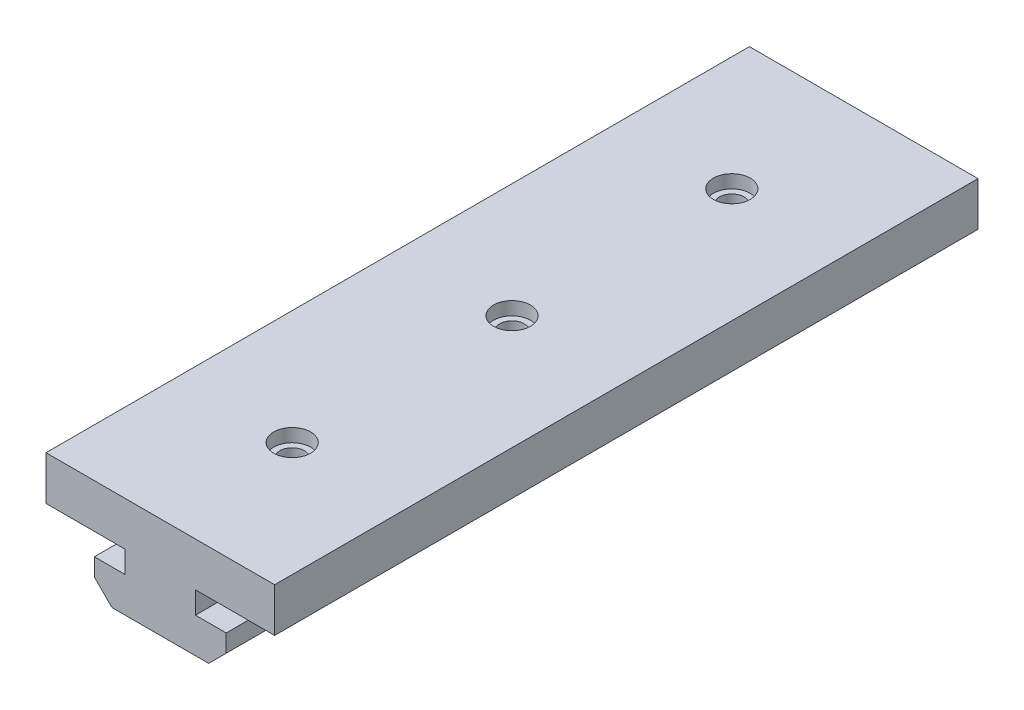
ISO-10303-21;
HEADER;
FILE_DESCRIPTION(('STEP AP214'),'2;1');
FILE_NAME('part.step','',(''),(''),'','','');
FILE_SCHEMA(('AUTOMOTIVE_DESIGN { 1 0 10303 214 1 1 1 1 }'));
ENDSEC;
DATA;
#1=APPLICATION_CONTEXT('core data for automotive mechanical design processes');
#2=APPLICATION_PROTOCOL_DEFINITION('international standard','automotive_design',2000,#1);
#3=PRODUCT_CONTEXT('',#1,'mechanical');
#4=PRODUCT('Part','Part','',(#3));
#5=PRODUCT_RELATED_PRODUCT_CATEGORY('part','',(#4));
#6=PRODUCT_DEFINITION_FORMATION('','',#4);
#7=PRODUCT_DEFINITION_CONTEXT('part definition',#1,'design');
#8=PRODUCT_DEFINITION('design','',#6,#7);
#9=PRODUCT_DEFINITION_SHAPE('','',#8);
#10=(LENGTH_UNIT() NAMED_UNIT(*) SI_UNIT(.MILLI.,.METRE.));
#11=(NAMED_UNIT(*) PLANE_ANGLE_UNIT() SI_UNIT($,.RADIAN.));
#12=(NAMED_UNIT(*) SI_UNIT($,.STERADIAN.) SOLID_ANGLE_UNIT());
#13=UNCERTAINTY_MEASURE_WITH_UNIT(LENGTH_MEASURE(1.E-05),#10,'distance_accuracy_value','');
#14=(GEOMETRIC_REPRESENTATION_CONTEXT(3) GLOBAL_UNCERTAINTY_ASSIGNED_CONTEXT((#13)) GLOBAL_UNIT_ASSIGNED_CONTEXT((#10,
#11,#12)) REPRESENTATION_CONTEXT('',''));
#15=CARTESIAN_POINT('',(0.,0.,0.));
#16=DIRECTION('',(0.,0.,1.));
#17=DIRECTION('',(1.,0.,0.));
#18=AXIS2_PLACEMENT_3D('',#15,#16,#17);
#19=CARTESIAN_POINT('',(-13.,5.,80.));
#20=DIRECTION('',(1.,0.,0.));
#21=DIRECTION('',(0.,0.,-1.));
#22=AXIS2_PLACEMENT_3D('',#19,#20,#21);
#23=PLANE('',#22);
#24=DIRECTION('',(0.,-1.,0.));
#25=VECTOR('',#24,1.);
#26=CARTESIAN_POINT('',(-13.,5.,0.));
#27=LINE('',#26,#25);
#28=CARTESIAN_POINT('',(-13.,5.,0.));
#29=VERTEX_POINT('',#28);
#30=CARTESIAN_POINT('',(-13.,0.,0.));
#31=VERTEX_POINT('',#30);
#32=EDGE_CURVE('E165',#29,#31,#27,.T.);
#33=ORIENTED_EDGE('',*,*,#32,.T.);
#34=DIRECTION('',(0.,0.,-1.));
#35=VECTOR('',#34,1.);
#36=CARTESIAN_POINT('',(-13.,0.,80.));
#37=LINE('',#36,#35);
#38=CARTESIAN_POINT('',(-13.,0.,80.));
#39=VERTEX_POINT('',#38);
#40=EDGE_CURVE('E11',#39,#31,#37,.T.);
#41=ORIENTED_EDGE('',*,*,#40,.F.);
#42=DIRECTION('',(0.,-1.,0.));
#43=VECTOR('',#42,1.);
#44=CARTESIAN_POINT('',(-13.,5.,80.));
#45=LINE('',#44,#43);
#46=CARTESIAN_POINT('',(-13.,5.,80.));
#47=VERTEX_POINT('',#46);
#48=EDGE_CURVE('E192',#47,#39,#45,.T.);
#49=ORIENTED_EDGE('',*,*,#48,.F.);
#50=DIRECTION('',(0.,0.,-1.));
#51=VECTOR('',#50,1.);
#52=CARTESIAN_POINT('',(-13.,5.,80.));
#53=LINE('',#52,#51);
#54=EDGE_CURVE('E161',#47,#29,#53,.T.);
#55=ORIENTED_EDGE('',*,*,#54,.T.);
#56=EDGE_LOOP('',(#33,#41,#49,#55));
#57=FACE_BOUND('',#56,.T.);
#58=ADVANCED_FACE('F33',(#57),#23,.F.);
#59=CARTESIAN_POINT('',(-13.,0.,80.));
#60=DIRECTION('',(0.,1.,0.));
#61=DIRECTION('',(0.,0.,1.));
#62=AXIS2_PLACEMENT_3D('',#59,#60,#61);
#63=PLANE('',#62);
#64=DIRECTION('',(1.,0.,0.));
#65=VECTOR('',#64,1.);
#66=CARTESIAN_POINT('',(-13.,0.,0.));
#67=LINE('',#66,#65);
#68=CARTESIAN_POINT('',(-4.,0.,0.));
#69=VERTEX_POINT('',#68);
#70=EDGE_CURVE('E168',#31,#69,#67,.T.);
#71=ORIENTED_EDGE('',*,*,#70,.T.);
#72=DIRECTION('',(0.,0.,-1.));
#73=VECTOR('',#72,1.);
#74=CARTESIAN_POINT('',(-4.,0.,80.));
#75=LINE('',#74,#73);
#76=CARTESIAN_POINT('',(-4.,0.,80.));
#77=VERTEX_POINT('',#76);
#78=EDGE_CURVE('E41',#77,#69,#75,.T.);
#79=ORIENTED_EDGE('',*,*,#78,.F.);
#80=DIRECTION('',(1.,0.,0.));
#81=VECTOR('',#80,1.);
#82=CARTESIAN_POINT('',(-13.,0.,80.));
#83=LINE('',#82,#81);
#84=EDGE_CURVE('E110',#39,#77,#83,.T.);
#85=ORIENTED_EDGE('',*,*,#84,.F.);
#86=ORIENTED_EDGE('',*,*,#40,.T.);
#87=EDGE_LOOP('',(#71,#79,#85,#86));
#88=FACE_BOUND('',#87,.T.);
#89=ADVANCED_FACE('F283',(#88),#63,.F.);
#90=CARTESIAN_POINT('',(-4.,0.,80.));
#91=DIRECTION('',(1.,0.,0.));
#92=DIRECTION('',(0.,0.,-1.));
#93=AXIS2_PLACEMENT_3D('',#90,#91,#92);
#94=PLANE('',#93);
#95=DIRECTION('',(0.,-1.,0.));
#96=VECTOR('',#95,1.);
#97=CARTESIAN_POINT('',(-4.,0.,0.));
#98=LINE('',#97,#96);
#99=CARTESIAN_POINT('',(-4.,-2.5,0.));
#100=VERTEX_POINT('',#99);
#101=EDGE_CURVE('E171',#69,#100,#98,.T.);
#102=ORIENTED_EDGE('',*,*,#101,.T.);
#103=DIRECTION('',(0.,0.,-1.));
#104=VECTOR('',#103,1.);
#105=CARTESIAN_POINT('',(-4.,-2.5,80.));
#106=LINE('',#105,#104);
#107=CARTESIAN_POINT('',(-4.,-2.5,80.));
#108=VERTEX_POINT('',#107);
#109=EDGE_CURVE('E217',#108,#100,#106,.T.);
#110=ORIENTED_EDGE('',*,*,#109,.F.);
#111=DIRECTION('',(0.,-1.,0.));
#112=VECTOR('',#111,1.);
#113=CARTESIAN_POINT('',(-4.,0.,80.));
#114=LINE('',#113,#112);
#115=EDGE_CURVE('E225',#77,#108,#114,.T.);
#116=ORIENTED_EDGE('',*,*,#115,.F.);
#117=ORIENTED_EDGE('',*,*,#78,.T.);
#118=EDGE_LOOP('',(#102,#110,#116,#117));
#119=FACE_BOUND('',#118,.T.);
#120=ADVANCED_FACE('F223',(#119),#94,.F.);
#121=CARTESIAN_POINT('',(-4.,-2.5,80.));
#122=DIRECTION('',(0.,-1.,0.));
#123=DIRECTION('',(0.,0.,-1.));
#124=AXIS2_PLACEMENT_3D('',#121,#122,#123);
#125=PLANE('',#124);
#126=DIRECTION('',(-1.,0.,0.));
#127=VECTOR('',#126,1.);
#128=CARTESIAN_POINT('',(-4.,-2.5,0.));
#129=LINE('',#128,#127);
#130=CARTESIAN_POINT('',(-7.5,-2.5,0.));
#131=VERTEX_POINT('',#130);
#132=EDGE_CURVE('E173',#100,#131,#129,.T.);
#133=ORIENTED_EDGE('',*,*,#132,.T.);
#134=DIRECTION('',(0.,0.,-1.));
#135=VECTOR('',#134,1.);
#136=CARTESIAN_POINT('',(-7.5,-2.5,80.));
#137=LINE('',#136,#135);
#138=CARTESIAN_POINT('',(-7.5,-2.5,80.));
#139=VERTEX_POINT('',#138);
#140=EDGE_CURVE('E214',#139,#131,#137,.T.);
#141=ORIENTED_EDGE('',*,*,#140,.F.);
#142=DIRECTION('',(-1.,0.,0.));
#143=VECTOR('',#142,1.);
#144=CARTESIAN_POINT('',(-4.,-2.5,80.));
#145=LINE('',#144,#143);
#146=EDGE_CURVE('E243',#108,#139,#145,.T.);
#147=ORIENTED_EDGE('',*,*,#146,.F.);
#148=ORIENTED_EDGE('',*,*,#109,.T.);
#149=EDGE_LOOP('',(#133,#141,#147,#148));
#150=FACE_BOUND('',#149,.T.);
#151=ADVANCED_FACE('F234',(#150),#125,.F.);
#152=CARTESIAN_POINT('',(-7.5,-2.5,80.));
#153=DIRECTION('',(1.,0.,0.));
#154=DIRECTION('',(0.,0.,-1.));
#155=AXIS2_PLACEMENT_3D('',#152,#153,#154);
#156=PLANE('',#155);
#157=DIRECTION('',(0.,-1.,0.));
#158=VECTOR('',#157,1.);
#159=CARTESIAN_POINT('',(-7.5,-2.5,0.));
#160=LINE('',#159,#158);
#161=CARTESIAN_POINT('',(-7.5,-4.5,0.));
#162=VERTEX_POINT('',#161);
#163=EDGE_CURVE('E175',#131,#162,#160,.T.);
#164=ORIENTED_EDGE('',*,*,#163,.T.);
#165=DIRECTION('',(0.,0.,-1.));
#166=VECTOR('',#165,1.);
#167=CARTESIAN_POINT('',(-7.5,-4.5,80.));
#168=LINE('',#167,#166);
#169=CARTESIAN_POINT('',(-7.5,-4.5,80.));
#170=VERTEX_POINT('',#169);
#171=EDGE_CURVE('E211',#170,#162,#168,.T.);
#172=ORIENTED_EDGE('',*,*,#171,.F.);
#173=DIRECTION('',(0.,-1.,0.));
#174=VECTOR('',#173,1.);
#175=CARTESIAN_POINT('',(-7.5,-2.5,80.));
#176=LINE('',#175,#174);
#177=EDGE_CURVE('E240',#139,#170,#176,.T.);
#178=ORIENTED_EDGE('',*,*,#177,.F.);
#179=ORIENTED_EDGE('',*,*,#140,.T.);
#180=EDGE_LOOP('',(#164,#172,#178,#179));
#181=FACE_BOUND('',#180,.T.);
#182=ADVANCED_FACE('F238',(#181),#156,.F.);
#183=CARTESIAN_POINT('',(-7.5,-4.5,80.));
#184=DIRECTION('',(0.707106781186548,0.707106781186548,0.));
#185=DIRECTION('',(-0.707106781186548,0.707106781186548,0.));
#186=AXIS2_PLACEMENT_3D('',#183,#184,#185);
#187=PLANE('',#186);
#188=DIRECTION('',(0.707106781186548,-0.707106781186548,0.));
#189=VECTOR('',#188,1.);
#190=CARTESIAN_POINT('',(-7.5,-4.5,0.));
#191=LINE('',#190,#189);
#192=CARTESIAN_POINT('',(-5.5,-6.5,0.));
#193=VERTEX_POINT('',#192);
#194=EDGE_CURVE('E177',#162,#193,#191,.T.);
#195=ORIENTED_EDGE('',*,*,#194,.T.);
#196=DIRECTION('',(0.,0.,-1.));
#197=VECTOR('',#196,1.);
#198=CARTESIAN_POINT('',(-5.5,-6.5,80.));
#199=LINE('',#198,#197);
#200=CARTESIAN_POINT('',(-5.5,-6.5,80.));
#201=VERTEX_POINT('',#200);
#202=EDGE_CURVE('E208',#201,#193,#199,.T.);
#203=ORIENTED_EDGE('',*,*,#202,.F.);
#204=DIRECTION('',(0.707106781186548,-0.707106781186548,0.));
#205=VECTOR('',#204,1.);
#206=CARTESIAN_POINT('',(-7.5,-4.5,80.));
#207=LINE('',#206,#205);
#208=EDGE_CURVE('E242',#170,#201,#207,.T.);
#209=ORIENTED_EDGE('',*,*,#208,.F.);
#210=ORIENTED_EDGE('',*,*,#171,.T.);
#211=EDGE_LOOP('',(#195,#203,#209,#210));
#212=FACE_BOUND('',#211,.T.);
#213=ADVANCED_FACE('F296',(#212),#187,.F.);
#214=CARTESIAN_POINT('',(-5.5,-6.5,80.));
#215=DIRECTION('',(0.,1.,0.));
#216=DIRECTION('',(0.,0.,1.));
#217=AXIS2_PLACEMENT_3D('',#214,#215,#216);
#218=PLANE('',#217);
#219=CARTESIAN_POINT('',(0.,-6.5,65.));
#220=DIRECTION('',(0.,1.,0.));
#221=DIRECTION('',(0.,0.,1.));
#222=AXIS2_PLACEMENT_3D('',#219,#220,#221);
#223=CIRCLE('',#222,2.1);
#224=CARTESIAN_POINT('',(0.,-6.5,67.1));
#225=VERTEX_POINT('',#224);
#226=EDGE_CURVE('E507',#225,#225,#223,.T.);
#227=ORIENTED_EDGE('',*,*,#226,.T.);
#228=EDGE_LOOP('',(#227));
#229=FACE_BOUND('',#228,.T.);
#230=CARTESIAN_POINT('',(0.,-6.5,40.));
#231=DIRECTION('',(0.,1.,0.));
#232=DIRECTION('',(0.,0.,1.));
#233=AXIS2_PLACEMENT_3D('',#230,#231,#232);
#234=CIRCLE('',#233,2.1);
#235=CARTESIAN_POINT('',(0.,-6.5,42.1));
#236=VERTEX_POINT('',#235);
#237=EDGE_CURVE('E526',#236,#236,#234,.T.);
#238=ORIENTED_EDGE('',*,*,#237,.T.);
#239=EDGE_LOOP('',(#238));
#240=FACE_BOUND('',#239,.T.);
#241=CARTESIAN_POINT('',(0.,-6.5,15.));
#242=DIRECTION('',(0.,1.,0.));
#243=DIRECTION('',(0.,0.,1.));
#244=AXIS2_PLACEMENT_3D('',#241,#242,#243);
#245=CIRCLE('',#244,2.1);
#246=CARTESIAN_POINT('',(0.,-6.5,17.1));
#247=VERTEX_POINT('',#246);
#248=EDGE_CURVE('E544',#247,#247,#245,.T.);
#249=ORIENTED_EDGE('',*,*,#248,.T.);
#250=EDGE_LOOP('',(#249));
#251=FACE_BOUND('',#250,.T.);
#252=DIRECTION('',(1.,0.,0.));
#253=VECTOR('',#252,1.);
#254=CARTESIAN_POINT('',(-5.5,-6.5,0.));
#255=LINE('',#254,#253);
#256=CARTESIAN_POINT('',(5.5,-6.5,0.));
#257=VERTEX_POINT('',#256);
#258=EDGE_CURVE('E179',#193,#257,#255,.T.);
#259=ORIENTED_EDGE('',*,*,#258,.T.);
#260=DIRECTION('',(0.,0.,-1.));
#261=VECTOR('',#260,1.);
#262=CARTESIAN_POINT('',(5.5,-6.5,80.));
#263=LINE('',#262,#261);
#264=CARTESIAN_POINT('',(5.5,-6.5,80.));
#265=VERTEX_POINT('',#264);
#266=EDGE_CURVE('E205',#265,#257,#263,.T.);
#267=ORIENTED_EDGE('',*,*,#266,.F.);
#268=DIRECTION('',(1.,0.,0.));
#269=VECTOR('',#268,1.);
#270=CARTESIAN_POINT('',(-5.5,-6.5,80.));
#271=LINE('',#270,#269);
#272=EDGE_CURVE('E245',#201,#265,#271,.T.);
#273=ORIENTED_EDGE('',*,*,#272,.F.);
#274=ORIENTED_EDGE('',*,*,#202,.T.);
#275=EDGE_LOOP('',(#259,#267,#273,#274));
#276=FACE_BOUND('',#275,.T.);
#277=ADVANCED_FACE('F299',(#229,#240,#251,#276),#218,.F.);
#278=CARTESIAN_POINT('',(5.5,-6.5,80.));
#279=DIRECTION('',(-0.707106781186548,0.707106781186548,0.));
#280=DIRECTION('',(-0.707106781186548,-0.707106781186548,0.));
#281=AXIS2_PLACEMENT_3D('',#278,#279,#280);
#282=PLANE('',#281);
#283=DIRECTION('',(0.707106781186548,0.707106781186548,0.));
#284=VECTOR('',#283,1.);
#285=CARTESIAN_POINT('',(5.5,-6.5,0.));
#286=LINE('',#285,#284);
#287=CARTESIAN_POINT('',(7.5,-4.5,0.));
#288=VERTEX_POINT('',#287);
#289=EDGE_CURVE('E181',#257,#288,#286,.T.);
#290=ORIENTED_EDGE('',*,*,#289,.T.);
#291=DIRECTION('',(0.,0.,-1.));
#292=VECTOR('',#291,1.);
#293=CARTESIAN_POINT('',(7.5,-4.5,80.));
#294=LINE('',#293,#292);
#295=CARTESIAN_POINT('',(7.5,-4.5,80.));
#296=VERTEX_POINT('',#295);
#297=EDGE_CURVE('E202',#296,#288,#294,.T.);
#298=ORIENTED_EDGE('',*,*,#297,.F.);
#299=DIRECTION('',(0.707106781186548,0.707106781186548,0.));
#300=VECTOR('',#299,1.);
#301=CARTESIAN_POINT('',(5.5,-6.5,80.));
#302=LINE('',#301,#300);
#303=EDGE_CURVE('E251',#265,#296,#302,.T.);
#304=ORIENTED_EDGE('',*,*,#303,.F.);
#305=ORIENTED_EDGE('',*,*,#266,.T.);
#306=EDGE_LOOP('',(#290,#298,#304,#305));
#307=FACE_BOUND('',#306,.T.);
#308=ADVANCED_FACE('F303',(#307),#282,.F.);
#309=CARTESIAN_POINT('',(7.5,-4.5,80.));
#310=DIRECTION('',(-1.,0.,0.));
#311=DIRECTION('',(0.,0.,1.));
#312=AXIS2_PLACEMENT_3D('',#309,#310,#311);
#313=PLANE('',#312);
#314=DIRECTION('',(0.,1.,0.));
#315=VECTOR('',#314,1.);
#316=CARTESIAN_POINT('',(7.5,-4.5,0.));
#317=LINE('',#316,#315);
#318=CARTESIAN_POINT('',(7.5,-2.5,0.));
#319=VERTEX_POINT('',#318);
#320=EDGE_CURVE('E183',#288,#319,#317,.T.);
#321=ORIENTED_EDGE('',*,*,#320,.T.);
#322=DIRECTION('',(0.,0.,-1.));
#323=VECTOR('',#322,1.);
#324=CARTESIAN_POINT('',(7.5,-2.5,80.));
#325=LINE('',#324,#323);
#326=CARTESIAN_POINT('',(7.5,-2.5,80.));
#327=VERTEX_POINT('',#326);
#328=EDGE_CURVE('E199',#327,#319,#325,.T.);
#329=ORIENTED_EDGE('',*,*,#328,.F.);
#330=DIRECTION('',(0.,1.,0.));
#331=VECTOR('',#330,1.);
#332=CARTESIAN_POINT('',(7.5,-4.5,80.));
#333=LINE('',#332,#331);
#334=EDGE_CURVE('E253',#296,#327,#333,.T.);
#335=ORIENTED_EDGE('',*,*,#334,.F.);
#336=ORIENTED_EDGE('',*,*,#297,.T.);
#337=EDGE_LOOP('',(#321,#329,#335,#336));
#338=FACE_BOUND('',#337,.T.);
#339=ADVANCED_FACE('F307',(#338),#313,.F.);
#340=CARTESIAN_POINT('',(7.5,-2.5,80.));
#341=DIRECTION('',(0.,-1.,0.));
#342=DIRECTION('',(0.,0.,-1.));
#343=AXIS2_PLACEMENT_3D('',#340,#341,#342);
#344=PLANE('',#343);
#345=DIRECTION('',(-1.,0.,0.));
#346=VECTOR('',#345,1.);
#347=CARTESIAN_POINT('',(7.5,-2.5,0.));
#348=LINE('',#347,#346);
#349=CARTESIAN_POINT('',(4.,-2.5,0.));
#350=VERTEX_POINT('',#349);
#351=EDGE_CURVE('E185',#319,#350,#348,.T.);
#352=ORIENTED_EDGE('',*,*,#351,.T.);
#353=DIRECTION('',(0.,0.,-1.));
#354=VECTOR('',#353,1.);
#355=CARTESIAN_POINT('',(4.,-2.5,80.));
#356=LINE('',#355,#354);
#357=CARTESIAN_POINT('',(4.,-2.5,80.));
#358=VERTEX_POINT('',#357);
#359=EDGE_CURVE('E196',#358,#350,#356,.T.);
#360=ORIENTED_EDGE('',*,*,#359,.F.);
#361=DIRECTION('',(-1.,0.,0.));
#362=VECTOR('',#361,1.);
#363=CARTESIAN_POINT('',(7.5,-2.5,80.));
#364=LINE('',#363,#362);
#365=EDGE_CURVE('E255',#327,#358,#364,.T.);
#366=ORIENTED_EDGE('',*,*,#365,.F.);
#367=ORIENTED_EDGE('',*,*,#328,.T.);
#368=EDGE_LOOP('',(#352,#360,#366,#367));
#369=FACE_BOUND('',#368,.T.);
#370=ADVANCED_FACE('F261',(#369),#344,.F.);
#371=CARTESIAN_POINT('',(4.,-2.5,80.));
#372=DIRECTION('',(-1.,0.,0.));
#373=DIRECTION('',(0.,0.,1.));
#374=AXIS2_PLACEMENT_3D('',#371,#372,#373);
#375=PLANE('',#374);
#376=DIRECTION('',(0.,1.,0.));
#377=VECTOR('',#376,1.);
#378=CARTESIAN_POINT('',(4.,-2.5,0.));
#379=LINE('',#378,#377);
#380=CARTESIAN_POINT('',(4.,0.,0.));
#381=VERTEX_POINT('',#380);
#382=EDGE_CURVE('E187',#350,#381,#379,.T.);
#383=ORIENTED_EDGE('',*,*,#382,.T.);
#384=DIRECTION('',(0.,0.,-1.));
#385=VECTOR('',#384,1.);
#386=CARTESIAN_POINT('',(4.,0.,80.));
#387=LINE('',#386,#385);
#388=CARTESIAN_POINT('',(4.,0.,80.));
#389=VERTEX_POINT('',#388);
#390=EDGE_CURVE('E156',#389,#381,#387,.T.);
#391=ORIENTED_EDGE('',*,*,#390,.F.);
#392=DIRECTION('',(0.,1.,0.));
#393=VECTOR('',#392,1.);
#394=CARTESIAN_POINT('',(4.,-2.5,80.));
#395=LINE('',#394,#393);
#396=EDGE_CURVE('E147',#358,#389,#395,.T.);
#397=ORIENTED_EDGE('',*,*,#396,.F.);
#398=ORIENTED_EDGE('',*,*,#359,.T.);
#399=EDGE_LOOP('',(#383,#391,#397,#398));
#400=FACE_BOUND('',#399,.T.);
#401=ADVANCED_FACE('F265',(#400),#375,.F.);
#402=CARTESIAN_POINT('',(4.,0.,80.));
#403=DIRECTION('',(0.,1.,0.));
#404=DIRECTION('',(0.,0.,1.));
#405=AXIS2_PLACEMENT_3D('',#402,#403,#404);
#406=PLANE('',#405);
#407=DIRECTION('',(1.,0.,0.));
#408=VECTOR('',#407,1.);
#409=CARTESIAN_POINT('',(4.,0.,0.));
#410=LINE('',#409,#408);
#411=CARTESIAN_POINT('',(13.,0.,0.));
#412=VERTEX_POINT('',#411);
#413=EDGE_CURVE('E155',#381,#412,#410,.T.);
#414=ORIENTED_EDGE('',*,*,#413,.T.);
#415=DIRECTION('',(0.,0.,-1.));
#416=VECTOR('',#415,1.);
#417=CARTESIAN_POINT('',(13.,0.,80.));
#418=LINE('',#417,#416);
#419=CARTESIAN_POINT('',(13.,0.,80.));
#420=VERTEX_POINT('',#419);
#421=EDGE_CURVE('E152',#420,#412,#418,.T.);
#422=ORIENTED_EDGE('',*,*,#421,.F.);
#423=DIRECTION('',(1.,0.,0.));
#424=VECTOR('',#423,1.);
#425=CARTESIAN_POINT('',(4.,0.,80.));
#426=LINE('',#425,#424);
#427=EDGE_CURVE('E141',#389,#420,#426,.T.);
#428=ORIENTED_EDGE('',*,*,#427,.F.);
#429=ORIENTED_EDGE('',*,*,#390,.T.);
#430=EDGE_LOOP('',(#414,#422,#428,#429));
#431=FACE_BOUND('',#430,.T.);
#432=ADVANCED_FACE('F153',(#431),#406,.F.);
#433=CARTESIAN_POINT('',(13.,0.,80.));
#434=DIRECTION('',(-1.,0.,0.));
#435=DIRECTION('',(0.,0.,1.));
#436=AXIS2_PLACEMENT_3D('',#433,#434,#435);
#437=PLANE('',#436);
#438=DIRECTION('',(0.,1.,0.));
#439=VECTOR('',#438,1.);
#440=CARTESIAN_POINT('',(13.,0.,0.));
#441=LINE('',#440,#439);
#442=CARTESIAN_POINT('',(13.,5.,0.));
#443=VERTEX_POINT('',#442);
#444=EDGE_CURVE('E96',#412,#443,#441,.T.);
#445=ORIENTED_EDGE('',*,*,#444,.T.);
#446=DIRECTION('',(0.,0.,-1.));
#447=VECTOR('',#446,1.);
#448=CARTESIAN_POINT('',(13.,5.,80.));
#449=LINE('',#448,#447);
#450=CARTESIAN_POINT('',(13.,5.,80.));
#451=VERTEX_POINT('',#450);
#452=EDGE_CURVE('E157',#451,#443,#449,.T.);
#453=ORIENTED_EDGE('',*,*,#452,.F.);
#454=DIRECTION('',(0.,1.,0.));
#455=VECTOR('',#454,1.);
#456=CARTESIAN_POINT('',(13.,0.,80.));
#457=LINE('',#456,#455);
#458=EDGE_CURVE('E145',#420,#451,#457,.T.);
#459=ORIENTED_EDGE('',*,*,#458,.F.);
#460=ORIENTED_EDGE('',*,*,#421,.T.);
#461=EDGE_LOOP('',(#445,#453,#459,#460));
#462=FACE_BOUND('',#461,.T.);
#463=ADVANCED_FACE('F159',(#462),#437,.F.);
#464=CARTESIAN_POINT('',(13.,5.,80.));
#465=DIRECTION('',(0.,-1.,0.));
#466=DIRECTION('',(0.,0.,-1.));
#467=AXIS2_PLACEMENT_3D('',#464,#465,#466);
#468=PLANE('',#467);
#469=CARTESIAN_POINT('',(0.,5.,65.));
#470=DIRECTION('',(0.,1.,0.));
#471=DIRECTION('',(0.,0.,1.));
#472=AXIS2_PLACEMENT_3D('',#469,#470,#471);
#473=CIRCLE('',#472,2.1);
#474=CARTESIAN_POINT('',(0.,5.,67.1));
#475=VERTEX_POINT('',#474);
#476=EDGE_CURVE('E523',#475,#475,#473,.T.);
#477=ORIENTED_EDGE('',*,*,#476,.F.);
#478=EDGE_LOOP('',(#477));
#479=FACE_BOUND('',#478,.T.);
#480=CARTESIAN_POINT('',(0.,5.,40.));
#481=DIRECTION('',(0.,1.,0.));
#482=DIRECTION('',(0.,0.,1.));
#483=AXIS2_PLACEMENT_3D('',#480,#481,#482);
#484=CIRCLE('',#483,2.1);
#485=CARTESIAN_POINT('',(0.,5.,42.1));
#486=VERTEX_POINT('',#485);
#487=EDGE_CURVE('E541',#486,#486,#484,.T.);
#488=ORIENTED_EDGE('',*,*,#487,.F.);
#489=EDGE_LOOP('',(#488));
#490=FACE_BOUND('',#489,.T.);
#491=CARTESIAN_POINT('',(0.,5.,15.));
#492=DIRECTION('',(0.,1.,0.));
#493=DIRECTION('',(0.,0.,1.));
#494=AXIS2_PLACEMENT_3D('',#491,#492,#493);
#495=CIRCLE('',#494,2.1);
#496=CARTESIAN_POINT('',(0.,5.,17.1));
#497=VERTEX_POINT('',#496);
#498=EDGE_CURVE('E169',#497,#497,#495,.T.);
#499=ORIENTED_EDGE('',*,*,#498,.F.);
#500=EDGE_LOOP('',(#499));
#501=FACE_BOUND('',#500,.T.);
#502=DIRECTION('',(-1.,0.,0.));
#503=VECTOR('',#502,1.);
#504=CARTESIAN_POINT('',(13.,5.,0.));
#505=LINE('',#504,#503);
#506=EDGE_CURVE('E102',#443,#29,#505,.T.);
#507=ORIENTED_EDGE('',*,*,#506,.T.);
#508=ORIENTED_EDGE('',*,*,#54,.F.);
#509=DIRECTION('',(-1.,0.,0.));
#510=VECTOR('',#509,1.);
#511=CARTESIAN_POINT('',(13.,5.,80.));
#512=LINE('',#511,#510);
#513=EDGE_CURVE('E49',#451,#47,#512,.T.);
#514=ORIENTED_EDGE('',*,*,#513,.F.);
#515=ORIENTED_EDGE('',*,*,#452,.T.);
#516=EDGE_LOOP('',(#507,#508,#514,#515));
#517=FACE_BOUND('',#516,.T.);
#518=ADVANCED_FACE('F269',(#479,#490,#501,#517),#468,.F.);
#519=CARTESIAN_POINT('',(-13.,0.,80.));
#520=DIRECTION('',(0.,0.,1.));
#521=DIRECTION('',(1.,0.,0.));
#522=AXIS2_PLACEMENT_3D('',#519,#520,#521);
#523=PLANE('',#522);
#524=ORIENTED_EDGE('',*,*,#48,.T.);
#525=ORIENTED_EDGE('',*,*,#84,.T.);
#526=ORIENTED_EDGE('',*,*,#115,.T.);
#527=ORIENTED_EDGE('',*,*,#146,.T.);
#528=ORIENTED_EDGE('',*,*,#177,.T.);
#529=ORIENTED_EDGE('',*,*,#208,.T.);
#530=ORIENTED_EDGE('',*,*,#272,.T.);
#531=ORIENTED_EDGE('',*,*,#303,.T.);
#532=ORIENTED_EDGE('',*,*,#334,.T.);
#533=ORIENTED_EDGE('',*,*,#365,.T.);
#534=ORIENTED_EDGE('',*,*,#396,.T.);
#535=ORIENTED_EDGE('',*,*,#427,.T.);
#536=ORIENTED_EDGE('',*,*,#458,.T.);
#537=ORIENTED_EDGE('',*,*,#513,.T.);
#538=EDGE_LOOP('',(#524,#525,#526,#527,#528,#529,#530,#531,#532,#533,#534,#535,#536,#537));
#539=FACE_BOUND('',#538,.T.);
#540=ADVANCED_FACE('F143',(#539),#523,.T.);
#541=CARTESIAN_POINT('',(-13.,0.,0.));
#542=DIRECTION('',(0.,0.,1.));
#543=DIRECTION('',(1.,0.,0.));
#544=AXIS2_PLACEMENT_3D('',#541,#542,#543);
#545=PLANE('',#544);
#546=ORIENTED_EDGE('',*,*,#32,.F.);
#547=ORIENTED_EDGE('',*,*,#506,.F.);
#548=ORIENTED_EDGE('',*,*,#444,.F.);
#549=ORIENTED_EDGE('',*,*,#413,.F.);
#550=ORIENTED_EDGE('',*,*,#382,.F.);
#551=ORIENTED_EDGE('',*,*,#351,.F.);
#552=ORIENTED_EDGE('',*,*,#320,.F.);
#553=ORIENTED_EDGE('',*,*,#289,.F.);
#554=ORIENTED_EDGE('',*,*,#258,.F.);
#555=ORIENTED_EDGE('',*,*,#194,.F.);
#556=ORIENTED_EDGE('',*,*,#163,.F.);
#557=ORIENTED_EDGE('',*,*,#132,.F.);
#558=ORIENTED_EDGE('',*,*,#101,.F.);
#559=ORIENTED_EDGE('',*,*,#70,.F.);
#560=EDGE_LOOP('',(#546,#547,#548,#549,#550,#551,#552,#553,#554,#555,#556,#557,#558,#559));
#561=FACE_BOUND('',#560,.T.);
#562=ADVANCED_FACE('F229',(#561),#545,.F.);
#563=CARTESIAN_POINT('',(0.,5.,15.));
#564=DIRECTION('',(0.,1.,0.));
#565=DIRECTION('',(0.,0.,1.));
#566=AXIS2_PLACEMENT_3D('',#563,#564,#565);
#567=CYLINDRICAL_SURFACE('',#566,2.1);
#568=CARTESIAN_POINT('',(0.,3.5,15.));
#569=DIRECTION('',(0.,1.,0.));
#570=DIRECTION('',(0.,0.,1.));
#571=AXIS2_PLACEMENT_3D('',#568,#569,#570);
#572=CIRCLE('',#571,2.1);
#573=CARTESIAN_POINT('',(0.,3.5,17.1));
#574=VERTEX_POINT('',#573);
#575=EDGE_CURVE('E556',#574,#574,#572,.T.);
#576=ORIENTED_EDGE('',*,*,#575,.F.);
#577=EDGE_LOOP('',(#576));
#578=FACE_BOUND('',#577,.T.);
#579=ORIENTED_EDGE('',*,*,#498,.T.);
#580=EDGE_LOOP('',(#579));
#581=FACE_BOUND('',#580,.T.);
#582=ADVANCED_FACE('F341',(#578,#581),#567,.F.);
#583=CARTESIAN_POINT('',(1.4,3.5,15.));
#584=DIRECTION('',(0.,-1.,0.));
#585=DIRECTION('',(0.,0.,-1.));
#586=AXIS2_PLACEMENT_3D('',#583,#584,#585);
#587=PLANE('',#586);
#588=CARTESIAN_POINT('',(0.,3.5,15.));
#589=DIRECTION('',(0.,1.,0.));
#590=DIRECTION('',(0.,0.,1.));
#591=AXIS2_PLACEMENT_3D('',#588,#589,#590);
#592=CIRCLE('',#591,1.4);
#593=CARTESIAN_POINT('',(0.,3.5,16.4));
#594=VERTEX_POINT('',#593);
#595=EDGE_CURVE('E553',#594,#594,#592,.T.);
#596=ORIENTED_EDGE('',*,*,#595,.F.);
#597=EDGE_LOOP('',(#596));
#598=FACE_BOUND('',#597,.T.);
#599=ORIENTED_EDGE('',*,*,#575,.T.);
#600=EDGE_LOOP('',(#599));
#601=FACE_BOUND('',#600,.T.);
#602=ADVANCED_FACE('F360',(#598,#601),#587,.F.);
#603=CARTESIAN_POINT('',(0.,5.,15.));
#604=DIRECTION('',(0.,1.,0.));
#605=DIRECTION('',(0.,0.,1.));
#606=AXIS2_PLACEMENT_3D('',#603,#604,#605);
#607=CYLINDRICAL_SURFACE('',#606,1.4);
#608=CARTESIAN_POINT('',(0.,-5.,15.));
#609=DIRECTION('',(0.,1.,0.));
#610=DIRECTION('',(0.,0.,1.));
#611=AXIS2_PLACEMENT_3D('',#608,#609,#610);
#612=CIRCLE('',#611,1.4);
#613=CARTESIAN_POINT('',(0.,-5.,16.4));
#614=VERTEX_POINT('',#613);
#615=EDGE_CURVE('E550',#614,#614,#612,.T.);
#616=ORIENTED_EDGE('',*,*,#615,.F.);
#617=EDGE_LOOP('',(#616));
#618=FACE_BOUND('',#617,.T.);
#619=ORIENTED_EDGE('',*,*,#595,.T.);
#620=EDGE_LOOP('',(#619));
#621=FACE_BOUND('',#620,.T.);
#622=ADVANCED_FACE('F370',(#618,#621),#607,.F.);
#623=CARTESIAN_POINT('',(1.4,-5.,15.));
#624=DIRECTION('',(0.,1.,0.));
#625=DIRECTION('',(0.,0.,1.));
#626=AXIS2_PLACEMENT_3D('',#623,#624,#625);
#627=PLANE('',#626);
#628=CARTESIAN_POINT('',(0.,-5.,15.));
#629=DIRECTION('',(0.,1.,0.));
#630=DIRECTION('',(0.,0.,1.));
#631=AXIS2_PLACEMENT_3D('',#628,#629,#630);
#632=CIRCLE('',#631,2.1);
#633=CARTESIAN_POINT('',(0.,-5.,17.1));
#634=VERTEX_POINT('',#633);
#635=EDGE_CURVE('E547',#634,#634,#632,.T.);
#636=ORIENTED_EDGE('',*,*,#635,.F.);
#637=EDGE_LOOP('',(#636));
#638=FACE_BOUND('',#637,.T.);
#639=ORIENTED_EDGE('',*,*,#615,.T.);
#640=EDGE_LOOP('',(#639));
#641=FACE_BOUND('',#640,.T.);
#642=ADVANCED_FACE('F380',(#638,#641),#627,.F.);
#643=CARTESIAN_POINT('',(0.,5.,15.));
#644=DIRECTION('',(0.,1.,0.));
#645=DIRECTION('',(0.,0.,1.));
#646=AXIS2_PLACEMENT_3D('',#643,#644,#645);
#647=CYLINDRICAL_SURFACE('',#646,2.1);
#648=ORIENTED_EDGE('',*,*,#248,.F.);
#649=EDGE_LOOP('',(#648));
#650=FACE_BOUND('',#649,.T.);
#651=ORIENTED_EDGE('',*,*,#635,.T.);
#652=EDGE_LOOP('',(#651));
#653=FACE_BOUND('',#652,.T.);
#654=ADVANCED_FACE('F390',(#650,#653),#647,.F.);
#655=CARTESIAN_POINT('',(0.,5.,40.));
#656=DIRECTION('',(0.,1.,0.));
#657=DIRECTION('',(0.,0.,1.));
#658=AXIS2_PLACEMENT_3D('',#655,#656,#657);
#659=CYLINDRICAL_SURFACE('',#658,2.1);
#660=CARTESIAN_POINT('',(0.,3.5,40.));
#661=DIRECTION('',(0.,1.,0.));
#662=DIRECTION('',(0.,0.,1.));
#663=AXIS2_PLACEMENT_3D('',#660,#661,#662);
#664=CIRCLE('',#663,2.1);
#665=CARTESIAN_POINT('',(0.,3.5,42.1));
#666=VERTEX_POINT('',#665);
#667=EDGE_CURVE('E538',#666,#666,#664,.T.);
#668=ORIENTED_EDGE('',*,*,#667,.F.);
#669=EDGE_LOOP('',(#668));
#670=FACE_BOUND('',#669,.T.);
#671=ORIENTED_EDGE('',*,*,#487,.T.);
#672=EDGE_LOOP('',(#671));
#673=FACE_BOUND('',#672,.T.);
#674=ADVANCED_FACE('F400',(#670,#673),#659,.F.);
#675=CARTESIAN_POINT('',(1.4,3.5,40.));
#676=DIRECTION('',(0.,-1.,0.));
#677=DIRECTION('',(0.,0.,-1.));
#678=AXIS2_PLACEMENT_3D('',#675,#676,#677);
#679=PLANE('',#678);
#680=CARTESIAN_POINT('',(0.,3.5,40.));
#681=DIRECTION('',(0.,1.,0.));
#682=DIRECTION('',(0.,0.,1.));
#683=AXIS2_PLACEMENT_3D('',#680,#681,#682);
#684=CIRCLE('',#683,1.4);
#685=CARTESIAN_POINT('',(0.,3.5,41.4));
#686=VERTEX_POINT('',#685);
#687=EDGE_CURVE('E535',#686,#686,#684,.T.);
#688=ORIENTED_EDGE('',*,*,#687,.F.);
#689=EDGE_LOOP('',(#688));
#690=FACE_BOUND('',#689,.T.);
#691=ORIENTED_EDGE('',*,*,#667,.T.);
#692=EDGE_LOOP('',(#691));
#693=FACE_BOUND('',#692,.T.);
#694=ADVANCED_FACE('F410',(#690,#693),#679,.F.);
#695=CARTESIAN_POINT('',(0.,5.,40.));
#696=DIRECTION('',(0.,1.,0.));
#697=DIRECTION('',(0.,0.,1.));
#698=AXIS2_PLACEMENT_3D('',#695,#696,#697);
#699=CYLINDRICAL_SURFACE('',#698,1.4);
#700=CARTESIAN_POINT('',(0.,-5.,40.));
#701=DIRECTION('',(0.,1.,0.));
#702=DIRECTION('',(0.,0.,1.));
#703=AXIS2_PLACEMENT_3D('',#700,#701,#702);
#704=CIRCLE('',#703,1.4);
#705=CARTESIAN_POINT('',(0.,-5.,41.4));
#706=VERTEX_POINT('',#705);
#707=EDGE_CURVE('E532',#706,#706,#704,.T.);
#708=ORIENTED_EDGE('',*,*,#707,.F.);
#709=EDGE_LOOP('',(#708));
#710=FACE_BOUND('',#709,.T.);
#711=ORIENTED_EDGE('',*,*,#687,.T.);
#712=EDGE_LOOP('',(#711));
#713=FACE_BOUND('',#712,.T.);
#714=ADVANCED_FACE('F420',(#710,#713),#699,.F.);
#715=CARTESIAN_POINT('',(1.4,-5.,40.));
#716=DIRECTION('',(0.,1.,0.));
#717=DIRECTION('',(0.,0.,1.));
#718=AXIS2_PLACEMENT_3D('',#715,#716,#717);
#719=PLANE('',#718);
#720=CARTESIAN_POINT('',(0.,-5.,40.));
#721=DIRECTION('',(0.,1.,0.));
#722=DIRECTION('',(0.,0.,1.));
#723=AXIS2_PLACEMENT_3D('',#720,#721,#722);
#724=CIRCLE('',#723,2.1);
#725=CARTESIAN_POINT('',(0.,-5.,42.1));
#726=VERTEX_POINT('',#725);
#727=EDGE_CURVE('E529',#726,#726,#724,.T.);
#728=ORIENTED_EDGE('',*,*,#727,.F.);
#729=EDGE_LOOP('',(#728));
#730=FACE_BOUND('',#729,.T.);
#731=ORIENTED_EDGE('',*,*,#707,.T.);
#732=EDGE_LOOP('',(#731));
#733=FACE_BOUND('',#732,.T.);
#734=ADVANCED_FACE('F430',(#730,#733),#719,.F.);
#735=CARTESIAN_POINT('',(0.,5.,40.));
#736=DIRECTION('',(0.,1.,0.));
#737=DIRECTION('',(0.,0.,1.));
#738=AXIS2_PLACEMENT_3D('',#735,#736,#737);
#739=CYLINDRICAL_SURFACE('',#738,2.1);
#740=ORIENTED_EDGE('',*,*,#237,.F.);
#741=EDGE_LOOP('',(#740));
#742=FACE_BOUND('',#741,.T.);
#743=ORIENTED_EDGE('',*,*,#727,.T.);
#744=EDGE_LOOP('',(#743));
#745=FACE_BOUND('',#744,.T.);
#746=ADVANCED_FACE('F440',(#742,#745),#739,.F.);
#747=CARTESIAN_POINT('',(0.,5.,65.));
#748=DIRECTION('',(0.,1.,0.));
#749=DIRECTION('',(0.,0.,1.));
#750=AXIS2_PLACEMENT_3D('',#747,#748,#749);
#751=CYLINDRICAL_SURFACE('',#750,2.1);
#752=CARTESIAN_POINT('',(0.,3.5,65.));
#753=DIRECTION('',(0.,1.,0.));
#754=DIRECTION('',(0.,0.,1.));
#755=AXIS2_PLACEMENT_3D('',#752,#753,#754);
#756=CIRCLE('',#755,2.1);
#757=CARTESIAN_POINT('',(0.,3.5,67.1));
#758=VERTEX_POINT('',#757);
#759=EDGE_CURVE('E520',#758,#758,#756,.T.);
#760=ORIENTED_EDGE('',*,*,#759,.F.);
#761=EDGE_LOOP('',(#760));
#762=FACE_BOUND('',#761,.T.);
#763=ORIENTED_EDGE('',*,*,#476,.T.);
#764=EDGE_LOOP('',(#763));
#765=FACE_BOUND('',#764,.T.);
#766=ADVANCED_FACE('F450',(#762,#765),#751,.F.);
#767=CARTESIAN_POINT('',(1.4,3.5,65.));
#768=DIRECTION('',(0.,-1.,0.));
#769=DIRECTION('',(0.,0.,-1.));
#770=AXIS2_PLACEMENT_3D('',#767,#768,#769);
#771=PLANE('',#770);
#772=CARTESIAN_POINT('',(0.,3.5,65.));
#773=DIRECTION('',(0.,1.,0.));
#774=DIRECTION('',(0.,0.,1.));
#775=AXIS2_PLACEMENT_3D('',#772,#773,#774);
#776=CIRCLE('',#775,1.4);
#777=CARTESIAN_POINT('',(0.,3.5,66.4));
#778=VERTEX_POINT('',#777);
#779=EDGE_CURVE('E514',#778,#778,#776,.T.);
#780=ORIENTED_EDGE('',*,*,#779,.F.);
#781=EDGE_LOOP('',(#780));
#782=FACE_BOUND('',#781,.T.);
#783=ORIENTED_EDGE('',*,*,#759,.T.);
#784=EDGE_LOOP('',(#783));
#785=FACE_BOUND('',#784,.T.);
#786=ADVANCED_FACE('F460',(#782,#785),#771,.F.);
#787=CARTESIAN_POINT('',(0.,5.,65.));
#788=DIRECTION('',(0.,1.,0.));
#789=DIRECTION('',(0.,0.,1.));
#790=AXIS2_PLACEMENT_3D('',#787,#788,#789);
#791=CYLINDRICAL_SURFACE('',#790,1.4);
#792=CARTESIAN_POINT('',(0.,-5.,65.));
#793=DIRECTION('',(0.,1.,0.));
#794=DIRECTION('',(0.,0.,1.));
#795=AXIS2_PLACEMENT_3D('',#792,#793,#794);
#796=CIRCLE('',#795,1.4);
#797=CARTESIAN_POINT('',(0.,-5.,66.4));
#798=VERTEX_POINT('',#797);
#799=EDGE_CURVE('E511',#798,#798,#796,.T.);
#800=ORIENTED_EDGE('',*,*,#799,.F.);
#801=EDGE_LOOP('',(#800));
#802=FACE_BOUND('',#801,.T.);
#803=ORIENTED_EDGE('',*,*,#779,.T.);
#804=EDGE_LOOP('',(#803));
#805=FACE_BOUND('',#804,.T.);
#806=ADVANCED_FACE('F470',(#802,#805),#791,.F.);
#807=CARTESIAN_POINT('',(1.4,-5.,65.));
#808=DIRECTION('',(0.,1.,0.));
#809=DIRECTION('',(0.,0.,1.));
#810=AXIS2_PLACEMENT_3D('',#807,#808,#809);
#811=PLANE('',#810);
#812=CARTESIAN_POINT('',(0.,-5.,65.));
#813=DIRECTION('',(0.,1.,0.));
#814=DIRECTION('',(0.,0.,1.));
#815=AXIS2_PLACEMENT_3D('',#812,#813,#814);
#816=CIRCLE('',#815,2.1);
#817=CARTESIAN_POINT('',(0.,-5.,67.1));
#818=VERTEX_POINT('',#817);
#819=EDGE_CURVE('E510',#818,#818,#816,.T.);
#820=ORIENTED_EDGE('',*,*,#819,.F.);
#821=EDGE_LOOP('',(#820));
#822=FACE_BOUND('',#821,.T.);
#823=ORIENTED_EDGE('',*,*,#799,.T.);
#824=EDGE_LOOP('',(#823));
#825=FACE_BOUND('',#824,.T.);
#826=ADVANCED_FACE('F480',(#822,#825),#811,.F.);
#827=CARTESIAN_POINT('',(0.,5.,65.));
#828=DIRECTION('',(0.,1.,0.));
#829=DIRECTION('',(0.,0.,1.));
#830=AXIS2_PLACEMENT_3D('',#827,#828,#829);
#831=CYLINDRICAL_SURFACE('',#830,2.1);
#832=ORIENTED_EDGE('',*,*,#226,.F.);
#833=EDGE_LOOP('',(#832));
#834=FACE_BOUND('',#833,.T.);
#835=ORIENTED_EDGE('',*,*,#819,.T.);
#836=EDGE_LOOP('',(#835));
#837=FACE_BOUND('',#836,.T.);
#838=ADVANCED_FACE('F490',(#834,#837),#831,.F.);
#839=CLOSED_SHELL('',(#58,#89,#120,#151,#182,#213,#277,#308,#339,#370,#401,#432,#463,#518,#540,
#562,#582,#602,#622,#642,#654,#674,#694,#714,#734,#746,#766,#786,#806,#826,#838));
#840=MANIFOLD_SOLID_BREP('B2',#839);
#841=ADVANCED_BREP_SHAPE_REPRESENTATION('',(#18,#840),#14);
#842=SHAPE_DEFINITION_REPRESENTATION(#9,#841);
ENDSEC;
END-ISO-10303-21;
